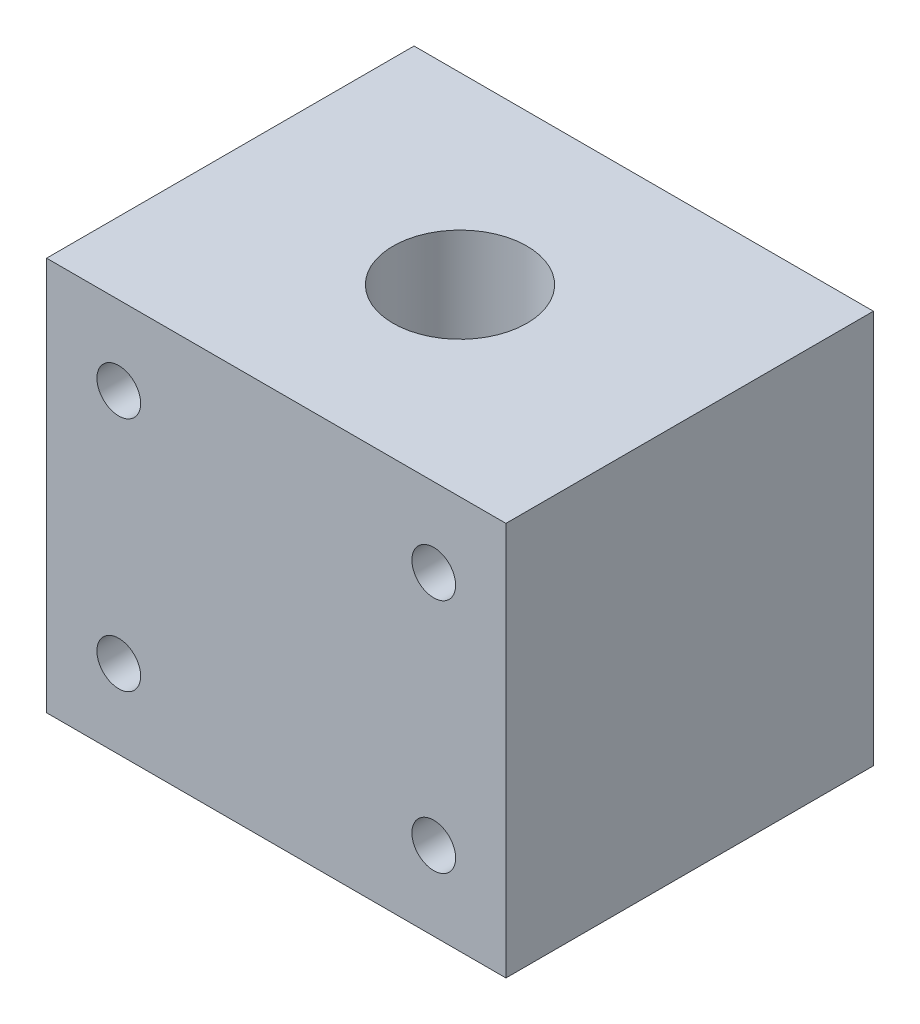
ISO-10303-21;
HEADER;
FILE_DESCRIPTION(('STEP AP214'),'2;1');
FILE_NAME('part.step','',(''),(''),'','','');
FILE_SCHEMA(('AUTOMOTIVE_DESIGN { 1 0 10303 214 1 1 1 1 }'));
ENDSEC;
DATA;
#1=APPLICATION_CONTEXT('core data for automotive mechanical design processes');
#2=APPLICATION_PROTOCOL_DEFINITION('international standard','automotive_design',2000,#1);
#3=PRODUCT_CONTEXT('',#1,'mechanical');
#4=PRODUCT('Part','Part','',(#3));
#5=PRODUCT_RELATED_PRODUCT_CATEGORY('part','',(#4));
#6=PRODUCT_DEFINITION_FORMATION('','',#4);
#7=PRODUCT_DEFINITION_CONTEXT('part definition',#1,'design');
#8=PRODUCT_DEFINITION('design','',#6,#7);
#9=PRODUCT_DEFINITION_SHAPE('','',#8);
#10=(LENGTH_UNIT() NAMED_UNIT(*) SI_UNIT(.MILLI.,.METRE.));
#11=(NAMED_UNIT(*) PLANE_ANGLE_UNIT() SI_UNIT($,.RADIAN.));
#12=(NAMED_UNIT(*) SI_UNIT($,.STERADIAN.) SOLID_ANGLE_UNIT());
#13=UNCERTAINTY_MEASURE_WITH_UNIT(LENGTH_MEASURE(1.E-05),#10,'distance_accuracy_value','');
#14=(GEOMETRIC_REPRESENTATION_CONTEXT(3) GLOBAL_UNCERTAINTY_ASSIGNED_CONTEXT((#13)) GLOBAL_UNIT_ASSIGNED_CONTEXT((#10,
#11,#12)) REPRESENTATION_CONTEXT('',''));
#15=CARTESIAN_POINT('',(0.,0.,0.));
#16=DIRECTION('',(0.,0.,1.));
#17=DIRECTION('',(1.,0.,0.));
#18=AXIS2_PLACEMENT_3D('',#15,#16,#17);
#19=CARTESIAN_POINT('',(0.,30.,0.));
#20=DIRECTION('',(0.,1.,0.));
#21=DIRECTION('',(1.,0.,0.));
#22=AXIS2_PLACEMENT_3D('',#19,#20,#21);
#23=PLANE('',#22);
#24=DIRECTION('',(-1.,0.,0.));
#25=VECTOR('',#24,1.);
#26=CARTESIAN_POINT('',(-17.5,30.,14.));
#27=LINE('',#26,#25);
#28=CARTESIAN_POINT('',(17.5,30.,14.));
#29=VERTEX_POINT('',#28);
#30=CARTESIAN_POINT('',(-17.5,30.,14.));
#31=VERTEX_POINT('',#30);
#32=EDGE_CURVE('E165',#29,#31,#27,.T.);
#33=ORIENTED_EDGE('',*,*,#32,.F.);
#34=DIRECTION('',(0.,0.,-1.));
#35=VECTOR('',#34,1.);
#36=CARTESIAN_POINT('',(17.5,30.,15.));
#37=LINE('',#36,#35);
#38=CARTESIAN_POINT('',(17.5,30.,-14.));
#39=VERTEX_POINT('',#38);
#40=EDGE_CURVE('E11',#29,#39,#37,.T.);
#41=ORIENTED_EDGE('',*,*,#40,.T.);
#42=DIRECTION('',(1.,0.,0.));
#43=VECTOR('',#42,1.);
#44=CARTESIAN_POINT('',(-17.5,30.,-14.));
#45=LINE('',#44,#43);
#46=CARTESIAN_POINT('',(-17.5,30.,-14.));
#47=VERTEX_POINT('',#46);
#48=EDGE_CURVE('E337',#47,#39,#45,.T.);
#49=ORIENTED_EDGE('',*,*,#48,.F.);
#50=DIRECTION('',(0.,0.,1.));
#51=VECTOR('',#50,1.);
#52=CARTESIAN_POINT('',(-17.5,30.,-15.));
#53=LINE('',#52,#51);
#54=EDGE_CURVE('E53',#47,#31,#53,.T.);
#55=ORIENTED_EDGE('',*,*,#54,.T.);
#56=EDGE_LOOP('',(#33,#41,#49,#55));
#57=FACE_BOUND('',#56,.T.);
#58=CARTESIAN_POINT('',(0.,30.,0.));
#59=DIRECTION('',(0.,-1.,0.));
#60=DIRECTION('',(-1.,0.,0.));
#61=AXIS2_PLACEMENT_3D('',#58,#59,#60);
#62=CIRCLE('',#61,5.1);
#63=CARTESIAN_POINT('',(5.1,30.,0.));
#64=VERTEX_POINT('',#63);
#65=EDGE_CURVE('E182',#64,#64,#62,.T.);
#66=ORIENTED_EDGE('',*,*,#65,.T.);
#67=EDGE_LOOP('',(#66));
#68=FACE_BOUND('',#67,.T.);
#69=ADVANCED_FACE('F44',(#57,#68),#23,.T.);
#70=CARTESIAN_POINT('',(17.5,0.,15.));
#71=DIRECTION('',(1.,0.,0.));
#72=DIRECTION('',(0.,0.,-1.));
#73=AXIS2_PLACEMENT_3D('',#70,#71,#72);
#74=PLANE('',#73);
#75=DIRECTION('',(0.,1.,0.));
#76=VECTOR('',#75,1.);
#77=CARTESIAN_POINT('',(17.5,0.,14.));
#78=LINE('',#77,#76);
#79=CARTESIAN_POINT('',(17.5,0.,14.));
#80=VERTEX_POINT('',#79);
#81=EDGE_CURVE('E152',#80,#29,#78,.T.);
#82=ORIENTED_EDGE('',*,*,#81,.F.);
#83=DIRECTION('',(0.,0.,-1.));
#84=VECTOR('',#83,1.);
#85=CARTESIAN_POINT('',(17.5,0.,15.));
#86=LINE('',#85,#84);
#87=CARTESIAN_POINT('',(17.5,0.,-14.));
#88=VERTEX_POINT('',#87);
#89=EDGE_CURVE('E163',#80,#88,#86,.T.);
#90=ORIENTED_EDGE('',*,*,#89,.T.);
#91=DIRECTION('',(0.,-1.,0.));
#92=VECTOR('',#91,1.);
#93=CARTESIAN_POINT('',(17.5,30.,-14.));
#94=LINE('',#93,#92);
#95=EDGE_CURVE('E340',#39,#88,#94,.T.);
#96=ORIENTED_EDGE('',*,*,#95,.F.);
#97=ORIENTED_EDGE('',*,*,#40,.F.);
#98=EDGE_LOOP('',(#82,#90,#96,#97));
#99=FACE_BOUND('',#98,.T.);
#100=ADVANCED_FACE('F161',(#99),#74,.T.);
#101=CARTESIAN_POINT('',(-17.5,0.,-15.));
#102=DIRECTION('',(-1.,0.,0.));
#103=DIRECTION('',(0.,1.,0.));
#104=AXIS2_PLACEMENT_3D('',#101,#102,#103);
#105=PLANE('',#104);
#106=DIRECTION('',(0.,-1.,0.));
#107=VECTOR('',#106,1.);
#108=CARTESIAN_POINT('',(-17.5,0.,14.));
#109=LINE('',#108,#107);
#110=CARTESIAN_POINT('',(-17.5,0.,14.));
#111=VERTEX_POINT('',#110);
#112=EDGE_CURVE('E61',#31,#111,#109,.T.);
#113=ORIENTED_EDGE('',*,*,#112,.F.);
#114=ORIENTED_EDGE('',*,*,#54,.F.);
#115=DIRECTION('',(0.,1.,0.));
#116=VECTOR('',#115,1.);
#117=CARTESIAN_POINT('',(-17.5,30.,-14.));
#118=LINE('',#117,#116);
#119=CARTESIAN_POINT('',(-17.5,0.,-14.));
#120=VERTEX_POINT('',#119);
#121=EDGE_CURVE('E335',#120,#47,#118,.T.);
#122=ORIENTED_EDGE('',*,*,#121,.F.);
#123=DIRECTION('',(0.,0.,1.));
#124=VECTOR('',#123,1.);
#125=CARTESIAN_POINT('',(-17.5,0.,-15.));
#126=LINE('',#125,#124);
#127=EDGE_CURVE('E170',#120,#111,#126,.T.);
#128=ORIENTED_EDGE('',*,*,#127,.T.);
#129=EDGE_LOOP('',(#113,#114,#122,#128));
#130=FACE_BOUND('',#129,.T.);
#131=ADVANCED_FACE('F46',(#130),#105,.T.);
#132=CARTESIAN_POINT('',(0.,0.,0.));
#133=DIRECTION('',(0.,1.,0.));
#134=DIRECTION('',(1.,0.,0.));
#135=AXIS2_PLACEMENT_3D('',#132,#133,#134);
#136=PLANE('',#135);
#137=CARTESIAN_POINT('',(0.,0.,0.));
#138=DIRECTION('',(0.,1.,0.));
#139=DIRECTION('',(-1.,0.,0.));
#140=AXIS2_PLACEMENT_3D('',#137,#138,#139);
#141=CIRCLE('',#140,11.);
#142=CARTESIAN_POINT('',(11.,0.,0.));
#143=VERTEX_POINT('',#142);
#144=EDGE_CURVE('E199',#143,#143,#141,.T.);
#145=ORIENTED_EDGE('',*,*,#144,.T.);
#146=EDGE_LOOP('',(#145));
#147=FACE_BOUND('',#146,.T.);
#148=ORIENTED_EDGE('',*,*,#89,.F.);
#149=DIRECTION('',(1.,0.,0.));
#150=VECTOR('',#149,1.);
#151=CARTESIAN_POINT('',(-17.5,0.,14.));
#152=LINE('',#151,#150);
#153=EDGE_CURVE('E148',#111,#80,#152,.T.);
#154=ORIENTED_EDGE('',*,*,#153,.F.);
#155=ORIENTED_EDGE('',*,*,#127,.F.);
#156=DIRECTION('',(-1.,0.,0.));
#157=VECTOR('',#156,1.);
#158=CARTESIAN_POINT('',(-17.5,0.,-14.));
#159=LINE('',#158,#157);
#160=EDGE_CURVE('E169',#88,#120,#159,.T.);
#161=ORIENTED_EDGE('',*,*,#160,.F.);
#162=EDGE_LOOP('',(#148,#154,#155,#161));
#163=FACE_BOUND('',#162,.T.);
#164=ADVANCED_FACE('F168',(#147,#163),#136,.F.);
#165=CARTESIAN_POINT('',(0.,4.,0.));
#166=DIRECTION('',(0.,1.,0.));
#167=DIRECTION('',(1.,0.,0.));
#168=AXIS2_PLACEMENT_3D('',#165,#166,#167);
#169=PLANE('',#168);
#170=CARTESIAN_POINT('',(0.,4.,0.));
#171=DIRECTION('',(0.,-1.,0.));
#172=DIRECTION('',(-1.,0.,0.));
#173=AXIS2_PLACEMENT_3D('',#170,#171,#172);
#174=CIRCLE('',#173,5.1);
#175=CARTESIAN_POINT('',(5.1,4.,0.));
#176=VERTEX_POINT('',#175);
#177=EDGE_CURVE('E202',#176,#176,#174,.T.);
#178=ORIENTED_EDGE('',*,*,#177,.F.);
#179=EDGE_LOOP('',(#178));
#180=FACE_BOUND('',#179,.T.);
#181=CARTESIAN_POINT('',(8.,4.,0.));
#182=DIRECTION('',(0.,1.,0.));
#183=DIRECTION('',(0.,0.,-1.));
#184=AXIS2_PLACEMENT_3D('',#181,#182,#183);
#185=CIRCLE('',#184,1.2645);
#186=CARTESIAN_POINT('',(8.,4.,1.2645));
#187=VERTEX_POINT('',#186);
#188=EDGE_CURVE('E183',#187,#187,#185,.T.);
#189=ORIENTED_EDGE('',*,*,#188,.T.);
#190=EDGE_LOOP('',(#189));
#191=FACE_BOUND('',#190,.T.);
#192=CARTESIAN_POINT('',(-8.,4.,0.));
#193=DIRECTION('',(0.,1.,0.));
#194=DIRECTION('',(0.,0.,-1.));
#195=AXIS2_PLACEMENT_3D('',#192,#193,#194);
#196=CIRCLE('',#195,1.2645);
#197=CARTESIAN_POINT('',(-8.,4.,1.2645));
#198=VERTEX_POINT('',#197);
#199=EDGE_CURVE('E178',#198,#198,#196,.T.);
#200=ORIENTED_EDGE('',*,*,#199,.T.);
#201=EDGE_LOOP('',(#200));
#202=FACE_BOUND('',#201,.T.);
#203=CARTESIAN_POINT('',(0.,4.,0.));
#204=DIRECTION('',(0.,1.,0.));
#205=DIRECTION('',(-1.,0.,0.));
#206=AXIS2_PLACEMENT_3D('',#203,#204,#205);
#207=CIRCLE('',#206,11.);
#208=CARTESIAN_POINT('',(11.,4.,0.));
#209=VERTEX_POINT('',#208);
#210=EDGE_CURVE('E171',#209,#209,#207,.T.);
#211=ORIENTED_EDGE('',*,*,#210,.F.);
#212=EDGE_LOOP('',(#211));
#213=FACE_BOUND('',#212,.T.);
#214=ADVANCED_FACE('F244',(#180,#191,#202,#213),#169,.F.);
#215=CARTESIAN_POINT('',(0.,0.,0.));
#216=DIRECTION('',(0.,1.,0.));
#217=DIRECTION('',(-1.,0.,0.));
#218=AXIS2_PLACEMENT_3D('',#215,#216,#217);
#219=CYLINDRICAL_SURFACE('',#218,11.);
#220=ORIENTED_EDGE('',*,*,#144,.F.);
#221=DIRECTION('',(0.,1.,0.));
#222=VECTOR('',#221,1.);
#223=CARTESIAN_POINT('',(11.,0.,0.));
#224=LINE('',#223,#222);
#225=EDGE_CURVE('E174',#143,#209,#224,.T.);
#226=ORIENTED_EDGE('',*,*,#225,.T.);
#227=ORIENTED_EDGE('',*,*,#210,.T.);
#228=ORIENTED_EDGE('',*,*,#225,.F.);
#229=EDGE_LOOP('',(#220,#226,#227,#228));
#230=FACE_BOUND('',#229,.T.);
#231=ADVANCED_FACE('F247',(#230),#219,.F.);
#232=CARTESIAN_POINT('',(0.,0.,0.));
#233=DIRECTION('',(0.,1.,0.));
#234=DIRECTION('',(-1.,0.,0.));
#235=AXIS2_PLACEMENT_3D('',#232,#233,#234);
#236=CYLINDRICAL_SURFACE('',#235,5.1);
#237=ORIENTED_EDGE('',*,*,#65,.F.);
#238=DIRECTION('',(0.,-1.,0.));
#239=VECTOR('',#238,1.);
#240=CARTESIAN_POINT('',(5.1,0.,0.));
#241=LINE('',#240,#239);
#242=EDGE_CURVE('E221',#64,#176,#241,.T.);
#243=ORIENTED_EDGE('',*,*,#242,.T.);
#244=ORIENTED_EDGE('',*,*,#177,.T.);
#245=ORIENTED_EDGE('',*,*,#242,.F.);
#246=EDGE_LOOP('',(#237,#243,#244,#245));
#247=FACE_BOUND('',#246,.T.);
#248=ADVANCED_FACE('F284',(#247),#236,.F.);
#249=CARTESIAN_POINT('',(8.,8.5,0.));
#250=DIRECTION('',(0.,1.,0.));
#251=DIRECTION('',(0.,0.,-1.));
#252=AXIS2_PLACEMENT_3D('',#249,#250,#251);
#253=CYLINDRICAL_SURFACE('',#252,1.2645);
#254=ORIENTED_EDGE('',*,*,#188,.F.);
#255=DIRECTION('',(0.,1.,0.));
#256=VECTOR('',#255,1.);
#257=CARTESIAN_POINT('',(8.,8.5,1.2645));
#258=LINE('',#257,#256);
#259=CARTESIAN_POINT('',(8.,13.,1.2645));
#260=VERTEX_POINT('',#259);
#261=EDGE_CURVE('E180',#187,#260,#258,.T.);
#262=ORIENTED_EDGE('',*,*,#261,.T.);
#263=CARTESIAN_POINT('',(8.,13.,0.));
#264=DIRECTION('',(0.,1.,0.));
#265=DIRECTION('',(0.,0.,-1.));
#266=AXIS2_PLACEMENT_3D('',#263,#264,#265);
#267=CIRCLE('',#266,1.2645);
#268=EDGE_CURVE('E218',#260,#260,#267,.T.);
#269=ORIENTED_EDGE('',*,*,#268,.T.);
#270=ORIENTED_EDGE('',*,*,#261,.F.);
#271=EDGE_LOOP('',(#254,#262,#269,#270));
#272=FACE_BOUND('',#271,.T.);
#273=ADVANCED_FACE('F242',(#272),#253,.F.);
#274=CARTESIAN_POINT('',(8.,13.3798236046367,0.));
#275=DIRECTION('',(0.,-1.,0.));
#276=DIRECTION('',(0.,0.,-1.));
#277=AXIS2_PLACEMENT_3D('',#274,#275,#276);
#278=CONICAL_SURFACE('',#277,0.632367367890697,1.02974425867665);
#279=ORIENTED_EDGE('',*,*,#268,.F.);
#280=DIRECTION('',(0.,0.515038074910054,-0.857167300702112));
#281=VECTOR('',#280,1.);
#282=CARTESIAN_POINT('',(8.,13.3798236046367,0.632367367890697));
#283=LINE('',#282,#281);
#284=CARTESIAN_POINT('',(8.,13.7597882527603,0.));
#285=VERTEX_POINT('',#284);
#286=EDGE_CURVE('E231',#260,#285,#283,.T.);
#287=ORIENTED_EDGE('',*,*,#286,.T.);
#288=ORIENTED_EDGE('',*,*,#286,.F.);
#289=EDGE_LOOP('',(#279,#287,#288));
#290=FACE_BOUND('',#289,.T.);
#291=ADVANCED_FACE('F239',(#290),#278,.F.);
#292=CARTESIAN_POINT('',(-8.,8.5,0.));
#293=DIRECTION('',(0.,1.,0.));
#294=DIRECTION('',(0.,0.,-1.));
#295=AXIS2_PLACEMENT_3D('',#292,#293,#294);
#296=CYLINDRICAL_SURFACE('',#295,1.2645);
#297=ORIENTED_EDGE('',*,*,#199,.F.);
#298=DIRECTION('',(0.,1.,0.));
#299=VECTOR('',#298,1.);
#300=CARTESIAN_POINT('',(-8.,8.5,1.2645));
#301=LINE('',#300,#299);
#302=CARTESIAN_POINT('',(-8.,13.,1.2645));
#303=VERTEX_POINT('',#302);
#304=EDGE_CURVE('E216',#198,#303,#301,.T.);
#305=ORIENTED_EDGE('',*,*,#304,.T.);
#306=CARTESIAN_POINT('',(-8.,13.,0.));
#307=DIRECTION('',(0.,1.,0.));
#308=DIRECTION('',(0.,0.,-1.));
#309=AXIS2_PLACEMENT_3D('',#306,#307,#308);
#310=CIRCLE('',#309,1.2645);
#311=EDGE_CURVE('E197',#303,#303,#310,.T.);
#312=ORIENTED_EDGE('',*,*,#311,.T.);
#313=ORIENTED_EDGE('',*,*,#304,.F.);
#314=EDGE_LOOP('',(#297,#305,#312,#313));
#315=FACE_BOUND('',#314,.T.);
#316=ADVANCED_FACE('F290',(#315),#296,.F.);
#317=CARTESIAN_POINT('',(-8.,13.3798236046367,0.));
#318=DIRECTION('',(0.,-1.,0.));
#319=DIRECTION('',(0.,0.,-1.));
#320=AXIS2_PLACEMENT_3D('',#317,#318,#319);
#321=CONICAL_SURFACE('',#320,0.632367367890697,1.02974425867665);
#322=ORIENTED_EDGE('',*,*,#311,.F.);
#323=DIRECTION('',(0.,0.515038074910054,-0.857167300702112));
#324=VECTOR('',#323,1.);
#325=CARTESIAN_POINT('',(-8.,13.3798236046367,0.632367367890697));
#326=LINE('',#325,#324);
#327=CARTESIAN_POINT('',(-8.,13.7597882527603,0.));
#328=VERTEX_POINT('',#327);
#329=EDGE_CURVE('E219',#303,#328,#326,.T.);
#330=ORIENTED_EDGE('',*,*,#329,.T.);
#331=ORIENTED_EDGE('',*,*,#329,.F.);
#332=EDGE_LOOP('',(#322,#330,#331));
#333=FACE_BOUND('',#332,.T.);
#334=ADVANCED_FACE('F286',(#333),#321,.F.);
#335=CARTESIAN_POINT('',(0.,0.,-14.));
#336=DIRECTION('',(0.,0.,1.));
#337=DIRECTION('',(1.,0.,0.));
#338=AXIS2_PLACEMENT_3D('',#335,#336,#337);
#339=PLANE('',#338);
#340=ORIENTED_EDGE('',*,*,#121,.T.);
#341=ORIENTED_EDGE('',*,*,#48,.T.);
#342=ORIENTED_EDGE('',*,*,#95,.T.);
#343=ORIENTED_EDGE('',*,*,#160,.T.);
#344=EDGE_LOOP('',(#340,#341,#342,#343));
#345=FACE_BOUND('',#344,.T.);
#346=ADVANCED_FACE('F289',(#345),#339,.F.);
#347=CARTESIAN_POINT('',(0.,0.,14.));
#348=DIRECTION('',(0.,0.,-1.));
#349=DIRECTION('',(-1.,0.,0.));
#350=AXIS2_PLACEMENT_3D('',#347,#348,#349);
#351=PLANE('',#350);
#352=ORIENTED_EDGE('',*,*,#112,.T.);
#353=ORIENTED_EDGE('',*,*,#153,.T.);
#354=ORIENTED_EDGE('',*,*,#81,.T.);
#355=ORIENTED_EDGE('',*,*,#32,.T.);
#356=EDGE_LOOP('',(#352,#353,#354,#355));
#357=FACE_BOUND('',#356,.T.);
#358=CARTESIAN_POINT('',(12.,6.,14.));
#359=DIRECTION('',(0.,0.,-1.));
#360=DIRECTION('',(-1.,0.,0.));
#361=AXIS2_PLACEMENT_3D('',#358,#359,#360);
#362=CIRCLE('',#361,1.666);
#363=CARTESIAN_POINT('',(10.334,6.,14.));
#364=VERTEX_POINT('',#363);
#365=EDGE_CURVE('E48',#364,#364,#362,.F.);
#366=ORIENTED_EDGE('',*,*,#365,.F.);
#367=EDGE_LOOP('',(#366));
#368=FACE_BOUND('',#367,.T.);
#369=CARTESIAN_POINT('',(-12.,24.,14.));
#370=DIRECTION('',(0.,0.,-1.));
#371=DIRECTION('',(-1.,0.,0.));
#372=AXIS2_PLACEMENT_3D('',#369,#370,#371);
#373=CIRCLE('',#372,1.666);
#374=CARTESIAN_POINT('',(-13.666,24.,14.));
#375=VERTEX_POINT('',#374);
#376=EDGE_CURVE('E326',#375,#375,#373,.F.);
#377=ORIENTED_EDGE('',*,*,#376,.F.);
#378=EDGE_LOOP('',(#377));
#379=FACE_BOUND('',#378,.T.);
#380=CARTESIAN_POINT('',(12.,24.,14.));
#381=DIRECTION('',(0.,0.,-1.));
#382=DIRECTION('',(-1.,0.,0.));
#383=AXIS2_PLACEMENT_3D('',#380,#381,#382);
#384=CIRCLE('',#383,1.666);
#385=CARTESIAN_POINT('',(10.334,24.,14.));
#386=VERTEX_POINT('',#385);
#387=EDGE_CURVE('E328',#386,#386,#384,.F.);
#388=ORIENTED_EDGE('',*,*,#387,.F.);
#389=EDGE_LOOP('',(#388));
#390=FACE_BOUND('',#389,.T.);
#391=CARTESIAN_POINT('',(-12.,6.,14.));
#392=DIRECTION('',(0.,0.,-1.));
#393=DIRECTION('',(-1.,0.,0.));
#394=AXIS2_PLACEMENT_3D('',#391,#392,#393);
#395=CIRCLE('',#394,1.666);
#396=CARTESIAN_POINT('',(-13.666,6.,14.));
#397=VERTEX_POINT('',#396);
#398=EDGE_CURVE('E67',#397,#397,#395,.F.);
#399=ORIENTED_EDGE('',*,*,#398,.F.);
#400=EDGE_LOOP('',(#399));
#401=FACE_BOUND('',#400,.T.);
#402=ADVANCED_FACE('F150',(#357,#368,#379,#390,#401),#351,.F.);
#403=CARTESIAN_POINT('',(-12.,24.,3.49934206086313));
#404=DIRECTION('',(0.,0.,1.));
#405=DIRECTION('',(1.,0.,0.));
#406=AXIS2_PLACEMENT_3D('',#403,#404,#405);
#407=CONICAL_SURFACE('',#406,0.832765264218607,1.02974425867665);
#408=CARTESIAN_POINT('',(-12.,24.,4.));
#409=DIRECTION('',(0.,0.,-1.));
#410=DIRECTION('',(1.,0.,0.));
#411=AXIS2_PLACEMENT_3D('',#408,#409,#410);
#412=CIRCLE('',#411,1.666);
#413=CARTESIAN_POINT('',(-13.666,24.,4.));
#414=VERTEX_POINT('',#413);
#415=EDGE_CURVE('E193',#414,#414,#412,.T.);
#416=ORIENTED_EDGE('',*,*,#415,.F.);
#417=DIRECTION('',(0.857167300702112,0.,-0.515038074910054));
#418=VECTOR('',#417,1.);
#419=CARTESIAN_POINT('',(-12.8327652642186,24.,3.49934206086313));
#420=LINE('',#419,#418);
#421=CARTESIAN_POINT('',(-12.,24.,2.99896620870009));
#422=VERTEX_POINT('',#421);
#423=EDGE_CURVE('E187',#414,#422,#420,.T.);
#424=ORIENTED_EDGE('',*,*,#423,.T.);
#425=ORIENTED_EDGE('',*,*,#423,.F.);
#426=EDGE_LOOP('',(#416,#424,#425));
#427=FACE_BOUND('',#426,.T.);
#428=ADVANCED_FACE('F272',(#427),#407,.F.);
#429=CARTESIAN_POINT('',(-12.,24.,9.5));
#430=DIRECTION('',(0.,0.,-1.));
#431=DIRECTION('',(1.,0.,0.));
#432=AXIS2_PLACEMENT_3D('',#429,#430,#431);
#433=CYLINDRICAL_SURFACE('',#432,1.666);
#434=DIRECTION('',(0.,0.,-1.));
#435=VECTOR('',#434,1.);
#436=CARTESIAN_POINT('',(-13.666,24.,9.5));
#437=LINE('',#436,#435);
#438=EDGE_CURVE('E184',#375,#414,#437,.T.);
#439=ORIENTED_EDGE('',*,*,#438,.F.);
#440=ORIENTED_EDGE('',*,*,#376,.T.);
#441=ORIENTED_EDGE('',*,*,#438,.T.);
#442=ORIENTED_EDGE('',*,*,#415,.T.);
#443=EDGE_LOOP('',(#439,#440,#441,#442));
#444=FACE_BOUND('',#443,.T.);
#445=ADVANCED_FACE('F275',(#444),#433,.F.);
#446=CARTESIAN_POINT('',(12.,24.,3.49934206086313));
#447=DIRECTION('',(0.,0.,1.));
#448=DIRECTION('',(1.,0.,0.));
#449=AXIS2_PLACEMENT_3D('',#446,#447,#448);
#450=CONICAL_SURFACE('',#449,0.832765264218607,1.02974425867665);
#451=CARTESIAN_POINT('',(12.,24.,4.));
#452=DIRECTION('',(0.,0.,-1.));
#453=DIRECTION('',(1.,0.,0.));
#454=AXIS2_PLACEMENT_3D('',#451,#452,#453);
#455=CIRCLE('',#454,1.666);
#456=CARTESIAN_POINT('',(10.334,24.,4.));
#457=VERTEX_POINT('',#456);
#458=EDGE_CURVE('E186',#457,#457,#455,.T.);
#459=ORIENTED_EDGE('',*,*,#458,.F.);
#460=DIRECTION('',(0.857167300702112,0.,-0.515038074910054));
#461=VECTOR('',#460,1.);
#462=CARTESIAN_POINT('',(11.1672347357814,24.,3.49934206086313));
#463=LINE('',#462,#461);
#464=CARTESIAN_POINT('',(12.,24.,2.99896620870009));
#465=VERTEX_POINT('',#464);
#466=EDGE_CURVE('E190',#457,#465,#463,.T.);
#467=ORIENTED_EDGE('',*,*,#466,.T.);
#468=ORIENTED_EDGE('',*,*,#466,.F.);
#469=EDGE_LOOP('',(#459,#467,#468));
#470=FACE_BOUND('',#469,.T.);
#471=ADVANCED_FACE('F294',(#470),#450,.F.);
#472=CARTESIAN_POINT('',(12.,24.,9.5));
#473=DIRECTION('',(0.,0.,-1.));
#474=DIRECTION('',(1.,0.,0.));
#475=AXIS2_PLACEMENT_3D('',#472,#473,#474);
#476=CYLINDRICAL_SURFACE('',#475,1.666);
#477=DIRECTION('',(0.,0.,-1.));
#478=VECTOR('',#477,1.);
#479=CARTESIAN_POINT('',(10.334,24.,9.5));
#480=LINE('',#479,#478);
#481=EDGE_CURVE('E203',#386,#457,#480,.T.);
#482=ORIENTED_EDGE('',*,*,#481,.F.);
#483=ORIENTED_EDGE('',*,*,#387,.T.);
#484=ORIENTED_EDGE('',*,*,#481,.T.);
#485=ORIENTED_EDGE('',*,*,#458,.T.);
#486=EDGE_LOOP('',(#482,#483,#484,#485));
#487=FACE_BOUND('',#486,.T.);
#488=ADVANCED_FACE('F281',(#487),#476,.F.);
#489=CARTESIAN_POINT('',(-12.,6.,3.49934206086313));
#490=DIRECTION('',(0.,0.,1.));
#491=DIRECTION('',(1.,0.,0.));
#492=AXIS2_PLACEMENT_3D('',#489,#490,#491);
#493=CONICAL_SURFACE('',#492,0.832765264218607,1.02974425867665);
#494=CARTESIAN_POINT('',(-12.,6.,4.));
#495=DIRECTION('',(0.,0.,-1.));
#496=DIRECTION('',(1.,0.,0.));
#497=AXIS2_PLACEMENT_3D('',#494,#495,#496);
#498=CIRCLE('',#497,1.666);
#499=CARTESIAN_POINT('',(-13.666,6.,4.));
#500=VERTEX_POINT('',#499);
#501=EDGE_CURVE('E205',#500,#500,#498,.T.);
#502=ORIENTED_EDGE('',*,*,#501,.F.);
#503=DIRECTION('',(0.857167300702112,0.,-0.515038074910054));
#504=VECTOR('',#503,1.);
#505=CARTESIAN_POINT('',(-12.8327652642186,6.,3.49934206086313));
#506=LINE('',#505,#504);
#507=CARTESIAN_POINT('',(-12.,6.,2.99896620870009));
#508=VERTEX_POINT('',#507);
#509=EDGE_CURVE('E198',#500,#508,#506,.T.);
#510=ORIENTED_EDGE('',*,*,#509,.T.);
#511=ORIENTED_EDGE('',*,*,#509,.F.);
#512=EDGE_LOOP('',(#502,#510,#511));
#513=FACE_BOUND('',#512,.T.);
#514=ADVANCED_FACE('F277',(#513),#493,.F.);
#515=CARTESIAN_POINT('',(-12.,6.,9.5));
#516=DIRECTION('',(0.,0.,-1.));
#517=DIRECTION('',(1.,0.,0.));
#518=AXIS2_PLACEMENT_3D('',#515,#516,#517);
#519=CYLINDRICAL_SURFACE('',#518,1.666);
#520=DIRECTION('',(0.,0.,-1.));
#521=VECTOR('',#520,1.);
#522=CARTESIAN_POINT('',(-13.666,6.,9.5));
#523=LINE('',#522,#521);
#524=EDGE_CURVE('E195',#397,#500,#523,.T.);
#525=ORIENTED_EDGE('',*,*,#524,.F.);
#526=ORIENTED_EDGE('',*,*,#398,.T.);
#527=ORIENTED_EDGE('',*,*,#524,.T.);
#528=ORIENTED_EDGE('',*,*,#501,.T.);
#529=EDGE_LOOP('',(#525,#526,#527,#528));
#530=FACE_BOUND('',#529,.T.);
#531=ADVANCED_FACE('F280',(#530),#519,.F.);
#532=CARTESIAN_POINT('',(12.,6.,3.49934206086313));
#533=DIRECTION('',(0.,0.,1.));
#534=DIRECTION('',(1.,0.,0.));
#535=AXIS2_PLACEMENT_3D('',#532,#533,#534);
#536=CONICAL_SURFACE('',#535,0.832765264218607,1.02974425867665);
#537=CARTESIAN_POINT('',(12.,6.,4.));
#538=DIRECTION('',(0.,0.,-1.));
#539=DIRECTION('',(1.,0.,0.));
#540=AXIS2_PLACEMENT_3D('',#537,#538,#539);
#541=CIRCLE('',#540,1.666);
#542=CARTESIAN_POINT('',(10.334,6.,4.));
#543=VERTEX_POINT('',#542);
#544=EDGE_CURVE('E207',#543,#543,#541,.T.);
#545=ORIENTED_EDGE('',*,*,#544,.F.);
#546=DIRECTION('',(0.857167300702112,0.,-0.515038074910054));
#547=VECTOR('',#546,1.);
#548=CARTESIAN_POINT('',(11.1672347357814,6.,3.49934206086313));
#549=LINE('',#548,#547);
#550=CARTESIAN_POINT('',(12.,6.,2.99896620870009));
#551=VERTEX_POINT('',#550);
#552=EDGE_CURVE('E194',#543,#551,#549,.T.);
#553=ORIENTED_EDGE('',*,*,#552,.T.);
#554=ORIENTED_EDGE('',*,*,#552,.F.);
#555=EDGE_LOOP('',(#545,#553,#554));
#556=FACE_BOUND('',#555,.T.);
#557=ADVANCED_FACE('F311',(#556),#536,.F.);
#558=CARTESIAN_POINT('',(12.,6.,9.5));
#559=DIRECTION('',(0.,0.,-1.));
#560=DIRECTION('',(1.,0.,0.));
#561=AXIS2_PLACEMENT_3D('',#558,#559,#560);
#562=CYLINDRICAL_SURFACE('',#561,1.666);
#563=DIRECTION('',(0.,0.,-1.));
#564=VECTOR('',#563,1.);
#565=CARTESIAN_POINT('',(10.334,6.,9.5));
#566=LINE('',#565,#564);
#567=EDGE_CURVE('E191',#364,#543,#566,.T.);
#568=ORIENTED_EDGE('',*,*,#567,.F.);
#569=ORIENTED_EDGE('',*,*,#365,.T.);
#570=ORIENTED_EDGE('',*,*,#567,.T.);
#571=ORIENTED_EDGE('',*,*,#544,.T.);
#572=EDGE_LOOP('',(#568,#569,#570,#571));
#573=FACE_BOUND('',#572,.T.);
#574=ADVANCED_FACE('F314',(#573),#562,.F.);
#575=CLOSED_SHELL('',(#69,#100,#131,#164,#214,#231,#248,#273,#291,#316,#334,#346,#402,#428,#445,
#471,#488,#514,#531,#557,#574));
#576=MANIFOLD_SOLID_BREP('B2',#575);
#577=ADVANCED_BREP_SHAPE_REPRESENTATION('',(#18,#576),#14);
#578=SHAPE_DEFINITION_REPRESENTATION(#9,#577);
ENDSEC;
END-ISO-10303-21;
